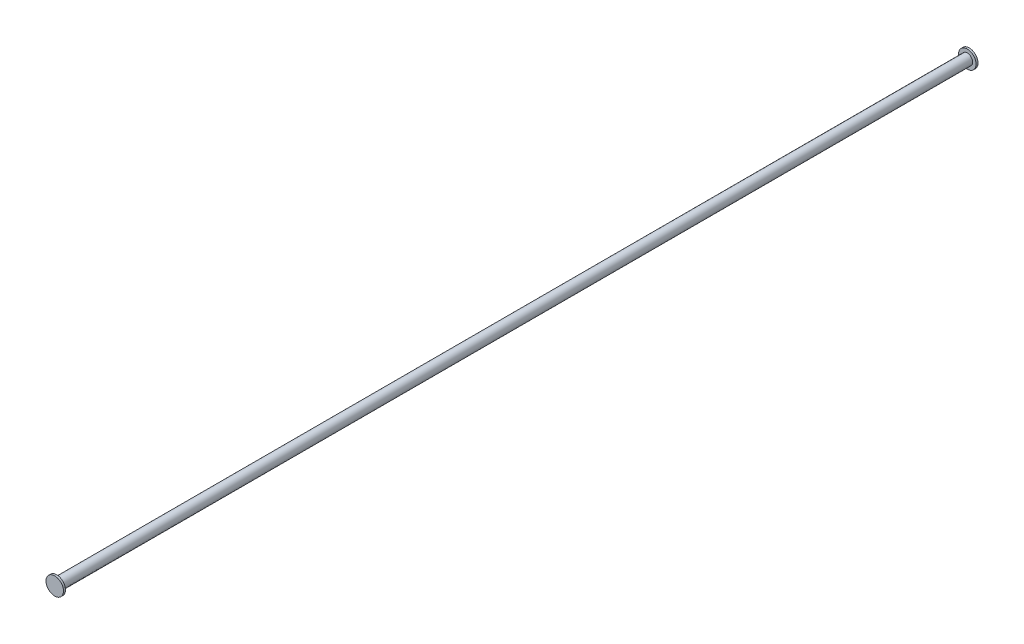
ISO-10303-21;
HEADER;
FILE_DESCRIPTION(('STEP AP214'),'2;1');
FILE_NAME('part.step','',(''),(''),'','','');
FILE_SCHEMA(('AUTOMOTIVE_DESIGN { 1 0 10303 214 1 1 1 1 }'));
ENDSEC;
DATA;
#1=APPLICATION_CONTEXT('core data for automotive mechanical design processes');
#2=APPLICATION_PROTOCOL_DEFINITION('international standard','automotive_design',2000,#1);
#3=PRODUCT_CONTEXT('',#1,'mechanical');
#4=PRODUCT('Part','Part','',(#3));
#5=PRODUCT_RELATED_PRODUCT_CATEGORY('part','',(#4));
#6=PRODUCT_DEFINITION_FORMATION('','',#4);
#7=PRODUCT_DEFINITION_CONTEXT('part definition',#1,'design');
#8=PRODUCT_DEFINITION('design','',#6,#7);
#9=PRODUCT_DEFINITION_SHAPE('','',#8);
#10=(LENGTH_UNIT() NAMED_UNIT(*) SI_UNIT(.MILLI.,.METRE.));
#11=(NAMED_UNIT(*) PLANE_ANGLE_UNIT() SI_UNIT($,.RADIAN.));
#12=(NAMED_UNIT(*) SI_UNIT($,.STERADIAN.) SOLID_ANGLE_UNIT());
#13=UNCERTAINTY_MEASURE_WITH_UNIT(LENGTH_MEASURE(1.E-05),#10,'distance_accuracy_value','');
#14=(GEOMETRIC_REPRESENTATION_CONTEXT(3) GLOBAL_UNCERTAINTY_ASSIGNED_CONTEXT((#13)) GLOBAL_UNIT_ASSIGNED_CONTEXT((#10,
#11,#12)) REPRESENTATION_CONTEXT('',''));
#15=CARTESIAN_POINT('',(0.,0.,0.));
#16=DIRECTION('',(0.,0.,1.));
#17=DIRECTION('',(1.,0.,0.));
#18=AXIS2_PLACEMENT_3D('',#15,#16,#17);
#19=CARTESIAN_POINT('',(0.,0.,117.));
#20=DIRECTION('',(0.,0.,-1.));
#21=DIRECTION('',(-1.,0.,0.));
#22=AXIS2_PLACEMENT_3D('',#19,#20,#21);
#23=CYLINDRICAL_SURFACE('',#22,1.375);
#24=CARTESIAN_POINT('',(0.,0.,117.));
#25=DIRECTION('',(0.,0.,1.));
#26=DIRECTION('',(1.,0.,0.));
#27=AXIS2_PLACEMENT_3D('',#24,#25,#26);
#28=CIRCLE('',#27,1.375);
#29=CARTESIAN_POINT('',(-1.375,0.,117.));
#30=VERTEX_POINT('',#29);
#31=EDGE_CURVE('E10',#30,#30,#28,.T.);
#32=CARTESIAN_POINT('',(0.,0.,-117.));
#33=DIRECTION('',(0.,0.,1.));
#34=DIRECTION('',(1.,0.,0.));
#35=AXIS2_PLACEMENT_3D('',#32,#33,#34);
#36=CIRCLE('',#35,1.375);
#37=CARTESIAN_POINT('',(-1.375,0.,-117.));
#38=VERTEX_POINT('',#37);
#39=EDGE_CURVE('E40',#38,#38,#36,.T.);
#40=CARTESIAN_POINT('',(-1.375,0.,117.));
#41=CARTESIAN_POINT('',(-1.375,0.,114.5625));
#42=CARTESIAN_POINT('',(-1.375,0.,112.125));
#43=CARTESIAN_POINT('',(-1.375,0.,107.25));
#44=CARTESIAN_POINT('',(-1.375,0.,104.8125));
#45=CARTESIAN_POINT('',(-1.375,0.,99.9375));
#46=CARTESIAN_POINT('',(-1.375,0.,97.5));
#47=CARTESIAN_POINT('',(-1.375,0.,92.625));
#48=CARTESIAN_POINT('',(-1.375,0.,90.1875));
#49=CARTESIAN_POINT('',(-1.375,0.,85.3125));
#50=CARTESIAN_POINT('',(-1.375,0.,82.875));
#51=CARTESIAN_POINT('',(-1.375,0.,78.));
#52=CARTESIAN_POINT('',(-1.375,0.,75.5625));
#53=CARTESIAN_POINT('',(-1.375,0.,70.6875));
#54=CARTESIAN_POINT('',(-1.375,0.,68.25));
#55=CARTESIAN_POINT('',(-1.375,0.,63.375));
#56=CARTESIAN_POINT('',(-1.375,0.,60.9375));
#57=CARTESIAN_POINT('',(-1.375,0.,56.0625));
#58=CARTESIAN_POINT('',(-1.375,0.,53.625));
#59=CARTESIAN_POINT('',(-1.375,0.,48.75));
#60=CARTESIAN_POINT('',(-1.375,0.,46.3125));
#61=CARTESIAN_POINT('',(-1.375,0.,41.4375));
#62=CARTESIAN_POINT('',(-1.375,0.,39.));
#63=CARTESIAN_POINT('',(-1.375,0.,34.125));
#64=CARTESIAN_POINT('',(-1.375,0.,31.6875));
#65=CARTESIAN_POINT('',(-1.375,0.,26.8125));
#66=CARTESIAN_POINT('',(-1.375,0.,24.375));
#67=CARTESIAN_POINT('',(-1.375,0.,19.5));
#68=CARTESIAN_POINT('',(-1.375,0.,17.0625));
#69=CARTESIAN_POINT('',(-1.375,0.,12.1875));
#70=CARTESIAN_POINT('',(-1.375,0.,9.74999999999998));
#71=CARTESIAN_POINT('',(-1.375,0.,4.87499999999999));
#72=CARTESIAN_POINT('',(-1.375,0.,2.43749999999999));
#73=CARTESIAN_POINT('',(-1.375,0.,-2.43750000000001));
#74=CARTESIAN_POINT('',(-1.375,0.,-4.87500000000001));
#75=CARTESIAN_POINT('',(-1.375,0.,-9.75000000000001));
#76=CARTESIAN_POINT('',(-1.375,0.,-12.1875));
#77=CARTESIAN_POINT('',(-1.375,0.,-17.0625));
#78=CARTESIAN_POINT('',(-1.375,0.,-19.5));
#79=CARTESIAN_POINT('',(-1.375,0.,-24.375));
#80=CARTESIAN_POINT('',(-1.375,0.,-26.8125));
#81=CARTESIAN_POINT('',(-1.375,0.,-31.6875));
#82=CARTESIAN_POINT('',(-1.375,0.,-34.125));
#83=CARTESIAN_POINT('',(-1.375,0.,-39.));
#84=CARTESIAN_POINT('',(-1.375,0.,-41.4375));
#85=CARTESIAN_POINT('',(-1.375,0.,-46.3125));
#86=CARTESIAN_POINT('',(-1.375,0.,-48.75));
#87=CARTESIAN_POINT('',(-1.375,0.,-53.625));
#88=CARTESIAN_POINT('',(-1.375,0.,-56.0625));
#89=CARTESIAN_POINT('',(-1.375,0.,-60.9375));
#90=CARTESIAN_POINT('',(-1.375,0.,-63.375));
#91=CARTESIAN_POINT('',(-1.375,0.,-68.25));
#92=CARTESIAN_POINT('',(-1.375,0.,-70.6875));
#93=CARTESIAN_POINT('',(-1.375,0.,-75.5625));
#94=CARTESIAN_POINT('',(-1.375,0.,-78.));
#95=CARTESIAN_POINT('',(-1.375,0.,-82.875));
#96=CARTESIAN_POINT('',(-1.375,0.,-85.3125));
#97=CARTESIAN_POINT('',(-1.375,0.,-90.1875));
#98=CARTESIAN_POINT('',(-1.375,0.,-92.625));
#99=CARTESIAN_POINT('',(-1.375,0.,-97.5));
#100=CARTESIAN_POINT('',(-1.375,0.,-99.9375));
#101=CARTESIAN_POINT('',(-1.375,0.,-104.8125));
#102=CARTESIAN_POINT('',(-1.375,0.,-107.25));
#103=CARTESIAN_POINT('',(-1.375,0.,-112.125));
#104=CARTESIAN_POINT('',(-1.375,0.,-114.5625));
#105=CARTESIAN_POINT('',(-1.375,0.,-117.));
#106=B_SPLINE_CURVE_WITH_KNOTS('',3,(#40,#41,#42,#43,#44,#45,#46,#47,#48,#49,#50,#51,#52,#53,
#54,#55,#56,#57,#58,#59,#60,#61,#62,#63,#64,#65,#66,#67,#68,#69,#70,#71,#72,#73,#74,#75,#76,#77,
#78,#79,#80,#81,#82,#83,#84,#85,#86,#87,#88,#89,#90,#91,#92,#93,#94,#95,#96,#97,#98,#99,#100,
#101,#102,#103,#104,#105),.UNSPECIFIED.,.F.,.F.,(4,2,2,2,2,2,2,2,2,2,2,2,2,2,2,2,2,2,2,2,2,2,2,
2,2,2,2,2,2,2,2,2,4),(0.,7.31250000000001,14.625,21.9375,29.25,36.5625,43.875,51.1875,58.5,
65.8125,73.125,80.4375,87.75,95.0625,102.375,109.6875,117.,124.3125,131.625,138.9375,146.25,
153.5625,160.875,168.1875,175.5,182.8125,190.125,197.4375,204.75,212.0625,219.375,226.6875,
234.),.UNSPECIFIED.);
#107=EDGE_CURVE('BSEAM37',#30,#38,#106,.T.);
#108=ORIENTED_EDGE('',*,*,#31,.F.);
#109=ORIENTED_EDGE('',*,*,#39,.T.);
#110=ORIENTED_EDGE('',*,*,#107,.T.);
#111=ORIENTED_EDGE('',*,*,#107,.F.);
#112=EDGE_LOOP('',(#108,#110,#109,#111));
#113=FACE_BOUND('',#112,.T.);
#114=ADVANCED_FACE('F37',(#113),#23,.T.);
#115=CARTESIAN_POINT('',(0.,0.,117.5));
#116=DIRECTION('',(0.,0.,-1.));
#117=DIRECTION('',(-1.,0.,0.));
#118=AXIS2_PLACEMENT_3D('',#115,#116,#117);
#119=CYLINDRICAL_SURFACE('',#118,2.25);
#120=CARTESIAN_POINT('',(0.,0.,117.5));
#121=DIRECTION('',(0.,0.,1.));
#122=DIRECTION('',(1.,0.,0.));
#123=AXIS2_PLACEMENT_3D('',#120,#121,#122);
#124=CIRCLE('',#123,2.25);
#125=CARTESIAN_POINT('',(2.25,0.,117.5));
#126=VERTEX_POINT('',#125);
#127=EDGE_CURVE('E45',#126,#126,#124,.T.);
#128=ORIENTED_EDGE('',*,*,#127,.F.);
#129=EDGE_LOOP('',(#128));
#130=FACE_BOUND('',#129,.T.);
#131=CARTESIAN_POINT('',(0.,0.,117.));
#132=DIRECTION('',(0.,0.,1.));
#133=DIRECTION('',(1.,0.,0.));
#134=AXIS2_PLACEMENT_3D('',#131,#132,#133);
#135=CIRCLE('',#134,2.25);
#136=CARTESIAN_POINT('',(2.25,0.,117.));
#137=VERTEX_POINT('',#136);
#138=EDGE_CURVE('E50',#137,#137,#135,.T.);
#139=ORIENTED_EDGE('',*,*,#138,.T.);
#140=EDGE_LOOP('',(#139));
#141=FACE_BOUND('',#140,.T.);
#142=ADVANCED_FACE('F91',(#130,#141),#119,.T.);
#143=CARTESIAN_POINT('',(0.,0.,117.5));
#144=DIRECTION('',(0.,0.,1.));
#145=DIRECTION('',(1.,0.,0.));
#146=AXIS2_PLACEMENT_3D('',#143,#144,#145);
#147=PLANE('',#146);
#148=ORIENTED_EDGE('',*,*,#127,.T.);
#149=EDGE_LOOP('',(#148));
#150=FACE_BOUND('',#149,.T.);
#151=ADVANCED_FACE('F87',(#150),#147,.T.);
#152=CARTESIAN_POINT('',(0.,0.,117.));
#153=DIRECTION('',(0.,0.,1.));
#154=DIRECTION('',(1.,0.,0.));
#155=AXIS2_PLACEMENT_3D('',#152,#153,#154);
#156=PLANE('',#155);
#157=ORIENTED_EDGE('',*,*,#31,.T.);
#158=EDGE_LOOP('',(#157));
#159=FACE_BOUND('',#158,.T.);
#160=ORIENTED_EDGE('',*,*,#138,.F.);
#161=EDGE_LOOP('',(#160));
#162=FACE_BOUND('',#161,.T.);
#163=ADVANCED_FACE('F79',(#159,#162),#156,.F.);
#164=CARTESIAN_POINT('',(0.,0.,-117.5));
#165=DIRECTION('',(0.,0.,1.));
#166=DIRECTION('',(1.,0.,0.));
#167=AXIS2_PLACEMENT_3D('',#164,#165,#166);
#168=CYLINDRICAL_SURFACE('',#167,2.25);
#169=CARTESIAN_POINT('',(0.,0.,-117.5));
#170=DIRECTION('',(0.,0.,1.));
#171=DIRECTION('',(1.,0.,0.));
#172=AXIS2_PLACEMENT_3D('',#169,#170,#171);
#173=CIRCLE('',#172,2.25);
#174=CARTESIAN_POINT('',(2.25,0.,-117.5));
#175=VERTEX_POINT('',#174);
#176=EDGE_CURVE('E60',#175,#175,#173,.T.);
#177=ORIENTED_EDGE('',*,*,#176,.T.);
#178=EDGE_LOOP('',(#177));
#179=FACE_BOUND('',#178,.T.);
#180=CARTESIAN_POINT('',(0.,0.,-117.));
#181=DIRECTION('',(0.,0.,1.));
#182=DIRECTION('',(1.,0.,0.));
#183=AXIS2_PLACEMENT_3D('',#180,#181,#182);
#184=CIRCLE('',#183,2.25);
#185=CARTESIAN_POINT('',(2.25,0.,-117.));
#186=VERTEX_POINT('',#185);
#187=EDGE_CURVE('E56',#186,#186,#184,.T.);
#188=ORIENTED_EDGE('',*,*,#187,.F.);
#189=EDGE_LOOP('',(#188));
#190=FACE_BOUND('',#189,.T.);
#191=ADVANCED_FACE('F77',(#179,#190),#168,.T.);
#192=CARTESIAN_POINT('',(0.,0.,-117.5));
#193=DIRECTION('',(0.,0.,-1.));
#194=DIRECTION('',(1.,0.,0.));
#195=AXIS2_PLACEMENT_3D('',#192,#193,#194);
#196=PLANE('',#195);
#197=ORIENTED_EDGE('',*,*,#176,.F.);
#198=EDGE_LOOP('',(#197));
#199=FACE_BOUND('',#198,.T.);
#200=ADVANCED_FACE('F73',(#199),#196,.T.);
#201=CARTESIAN_POINT('',(0.,0.,-117.));
#202=DIRECTION('',(0.,0.,-1.));
#203=DIRECTION('',(1.,0.,0.));
#204=AXIS2_PLACEMENT_3D('',#201,#202,#203);
#205=PLANE('',#204);
#206=ORIENTED_EDGE('',*,*,#39,.F.);
#207=EDGE_LOOP('',(#206));
#208=FACE_BOUND('',#207,.T.);
#209=ORIENTED_EDGE('',*,*,#187,.T.);
#210=EDGE_LOOP('',(#209));
#211=FACE_BOUND('',#210,.T.);
#212=ADVANCED_FACE('F70',(#208,#211),#205,.F.);
#213=CLOSED_SHELL('',(#114,#142,#151,#163,#191,#200,#212));
#214=MANIFOLD_SOLID_BREP('B2',#213);
#215=ADVANCED_BREP_SHAPE_REPRESENTATION('',(#18,#214),#14);
#216=SHAPE_DEFINITION_REPRESENTATION(#9,#215);
ENDSEC;
END-ISO-10303-21;
